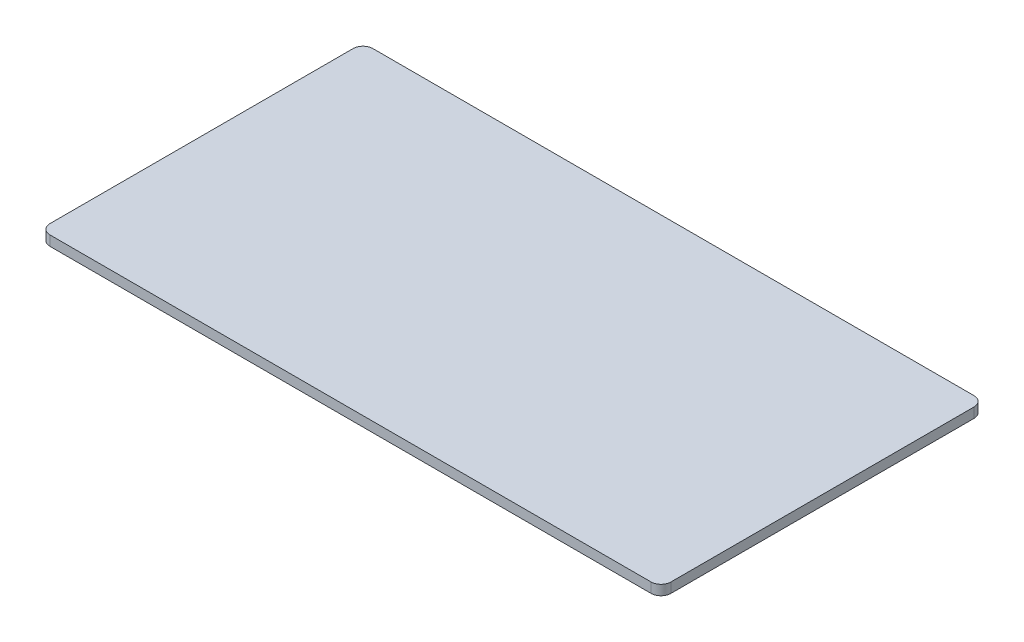
ISO-10303-21;
HEADER;
FILE_DESCRIPTION(('STEP AP214'),'2;1');
FILE_NAME('part.step','',(''),(''),'','','');
FILE_SCHEMA(('AUTOMOTIVE_DESIGN { 1 0 10303 214 1 1 1 1 }'));
ENDSEC;
DATA;
#1=APPLICATION_CONTEXT('core data for automotive mechanical design processes');
#2=APPLICATION_PROTOCOL_DEFINITION('international standard','automotive_design',2000,#1);
#3=PRODUCT_CONTEXT('',#1,'mechanical');
#4=PRODUCT('Part','Part','',(#3));
#5=PRODUCT_RELATED_PRODUCT_CATEGORY('part','',(#4));
#6=PRODUCT_DEFINITION_FORMATION('','',#4);
#7=PRODUCT_DEFINITION_CONTEXT('part definition',#1,'design');
#8=PRODUCT_DEFINITION('design','',#6,#7);
#9=PRODUCT_DEFINITION_SHAPE('','',#8);
#10=(LENGTH_UNIT() NAMED_UNIT(*) SI_UNIT(.MILLI.,.METRE.));
#11=(NAMED_UNIT(*) PLANE_ANGLE_UNIT() SI_UNIT($,.RADIAN.));
#12=(NAMED_UNIT(*) SI_UNIT($,.STERADIAN.) SOLID_ANGLE_UNIT());
#13=UNCERTAINTY_MEASURE_WITH_UNIT(LENGTH_MEASURE(1.E-05),#10,'distance_accuracy_value','');
#14=(GEOMETRIC_REPRESENTATION_CONTEXT(3) GLOBAL_UNCERTAINTY_ASSIGNED_CONTEXT((#13)) GLOBAL_UNIT_ASSIGNED_CONTEXT((#10,
#11,#12)) REPRESENTATION_CONTEXT('',''));
#15=CARTESIAN_POINT('',(0.,0.,0.));
#16=DIRECTION('',(0.,0.,1.));
#17=DIRECTION('',(1.,0.,0.));
#18=AXIS2_PLACEMENT_3D('',#15,#16,#17);
#19=CARTESIAN_POINT('',(1.38777878078145E-13,2.54,2.91433543964104E-13));
#20=DIRECTION('',(0.,0.,-1.));
#21=DIRECTION('',(-1.,0.,0.));
#22=AXIS2_PLACEMENT_3D('',#19,#20,#21);
#23=PLANE('',#22);
#24=DIRECTION('',(1.,0.,0.));
#25=VECTOR('',#24,1.);
#26=CARTESIAN_POINT('',(1.38777878078145E-13,2.54,2.91433543964104E-13));
#27=LINE('',#26,#25);
#28=CARTESIAN_POINT('',(2.54000000000014,2.54,2.91433543964104E-13));
#29=VERTEX_POINT('',#28);
#30=CARTESIAN_POINT('',(156.21,2.54,2.91433543964104E-13));
#31=VERTEX_POINT('',#30);
#32=EDGE_CURVE('E133',#29,#31,#27,.T.);
#33=ORIENTED_EDGE('',*,*,#32,.F.);
#34=DIRECTION('',(0.,-1.,0.));
#35=VECTOR('',#34,1.);
#36=CARTESIAN_POINT('',(2.54000000000014,2.54,2.91433543964104E-13));
#37=LINE('',#36,#35);
#38=CARTESIAN_POINT('',(2.54000000000014,0.,2.91433543964104E-13));
#39=VERTEX_POINT('',#38);
#40=EDGE_CURVE('E117',#29,#39,#37,.T.);
#41=ORIENTED_EDGE('',*,*,#40,.T.);
#42=DIRECTION('',(1.,0.,0.));
#43=VECTOR('',#42,1.);
#44=CARTESIAN_POINT('',(1.38777878078145E-13,0.,2.91433543964104E-13));
#45=LINE('',#44,#43);
#46=CARTESIAN_POINT('',(156.21,0.,2.91433543964104E-13));
#47=VERTEX_POINT('',#46);
#48=EDGE_CURVE('E130',#39,#47,#45,.T.);
#49=ORIENTED_EDGE('',*,*,#48,.T.);
#50=DIRECTION('',(0.,-1.,0.));
#51=VECTOR('',#50,1.);
#52=CARTESIAN_POINT('',(156.21,2.54,2.91433543964104E-13));
#53=LINE('',#52,#51);
#54=EDGE_CURVE('E136',#47,#31,#53,.F.);
#55=ORIENTED_EDGE('',*,*,#54,.T.);
#56=EDGE_LOOP('',(#33,#41,#49,#55));
#57=FACE_BOUND('',#56,.T.);
#58=ADVANCED_FACE('F46',(#57),#23,.F.);
#59=CARTESIAN_POINT('',(158.75,2.54,2.91433543964104E-13));
#60=DIRECTION('',(-1.,0.,0.));
#61=DIRECTION('',(0.,0.,1.));
#62=AXIS2_PLACEMENT_3D('',#59,#60,#61);
#63=PLANE('',#62);
#64=DIRECTION('',(0.,0.,-1.));
#65=VECTOR('',#64,1.);
#66=CARTESIAN_POINT('',(158.75,2.54,2.91433543964104E-13));
#67=LINE('',#66,#65);
#68=CARTESIAN_POINT('',(158.75,2.54,-2.53999999999971));
#69=VERTEX_POINT('',#68);
#70=CARTESIAN_POINT('',(158.75,2.54,-80.0099999999997));
#71=VERTEX_POINT('',#70);
#72=EDGE_CURVE('E187',#69,#71,#67,.T.);
#73=ORIENTED_EDGE('',*,*,#72,.F.);
#74=DIRECTION('',(0.,-1.,0.));
#75=VECTOR('',#74,1.);
#76=CARTESIAN_POINT('',(158.75,2.54,-2.53999999999971));
#77=LINE('',#76,#75);
#78=CARTESIAN_POINT('',(158.75,0.,-2.53999999999971));
#79=VERTEX_POINT('',#78);
#80=EDGE_CURVE('E203',#69,#79,#77,.T.);
#81=ORIENTED_EDGE('',*,*,#80,.T.);
#82=DIRECTION('',(0.,0.,-1.));
#83=VECTOR('',#82,1.);
#84=CARTESIAN_POINT('',(158.75,0.,2.91433543964104E-13));
#85=LINE('',#84,#83);
#86=CARTESIAN_POINT('',(158.75,0.,-80.0099999999997));
#87=VERTEX_POINT('',#86);
#88=EDGE_CURVE('E141',#79,#87,#85,.T.);
#89=ORIENTED_EDGE('',*,*,#88,.T.);
#90=DIRECTION('',(0.,-1.,0.));
#91=VECTOR('',#90,1.);
#92=CARTESIAN_POINT('',(158.75,2.54,-80.0099999999997));
#93=LINE('',#92,#91);
#94=EDGE_CURVE('E200',#87,#71,#93,.F.);
#95=ORIENTED_EDGE('',*,*,#94,.T.);
#96=EDGE_LOOP('',(#73,#81,#89,#95));
#97=FACE_BOUND('',#96,.T.);
#98=ADVANCED_FACE('F225',(#97),#63,.F.);
#99=CARTESIAN_POINT('',(1.38777878078145E-13,2.54,-82.5499999999997));
#100=DIRECTION('',(0.,0.,1.));
#101=DIRECTION('',(1.,0.,0.));
#102=AXIS2_PLACEMENT_3D('',#99,#100,#101);
#103=PLANE('',#102);
#104=DIRECTION('',(-1.,0.,0.));
#105=VECTOR('',#104,1.);
#106=CARTESIAN_POINT('',(1.38777878078145E-13,2.54,-82.5499999999997));
#107=LINE('',#106,#105);
#108=CARTESIAN_POINT('',(156.21,2.54,-82.5499999999997));
#109=VERTEX_POINT('',#108);
#110=CARTESIAN_POINT('',(2.54000000000014,2.54,-82.5499999999997));
#111=VERTEX_POINT('',#110);
#112=EDGE_CURVE('E184',#109,#111,#107,.T.);
#113=ORIENTED_EDGE('',*,*,#112,.F.);
#114=DIRECTION('',(0.,-1.,0.));
#115=VECTOR('',#114,1.);
#116=CARTESIAN_POINT('',(156.21,2.54,-82.5499999999997));
#117=LINE('',#116,#115);
#118=CARTESIAN_POINT('',(156.21,0.,-82.5499999999997));
#119=VERTEX_POINT('',#118);
#120=EDGE_CURVE('E12',#109,#119,#117,.T.);
#121=ORIENTED_EDGE('',*,*,#120,.T.);
#122=DIRECTION('',(-1.,0.,0.));
#123=VECTOR('',#122,1.);
#124=CARTESIAN_POINT('',(1.38777878078145E-13,0.,-82.5499999999997));
#125=LINE('',#124,#123);
#126=CARTESIAN_POINT('',(2.54000000000014,0.,-82.5499999999997));
#127=VERTEX_POINT('',#126);
#128=EDGE_CURVE('E145',#119,#127,#125,.T.);
#129=ORIENTED_EDGE('',*,*,#128,.T.);
#130=DIRECTION('',(0.,-1.,0.));
#131=VECTOR('',#130,1.);
#132=CARTESIAN_POINT('',(2.54000000000014,2.54,-82.5499999999997));
#133=LINE('',#132,#131);
#134=EDGE_CURVE('E55',#127,#111,#133,.F.);
#135=ORIENTED_EDGE('',*,*,#134,.T.);
#136=EDGE_LOOP('',(#113,#121,#129,#135));
#137=FACE_BOUND('',#136,.T.);
#138=ADVANCED_FACE('F218',(#137),#103,.F.);
#139=CARTESIAN_POINT('',(1.38777878078145E-13,2.54,2.91433543964104E-13));
#140=DIRECTION('',(1.,0.,0.));
#141=DIRECTION('',(0.,0.,-1.));
#142=AXIS2_PLACEMENT_3D('',#139,#140,#141);
#143=PLANE('',#142);
#144=DIRECTION('',(0.,0.,1.));
#145=VECTOR('',#144,1.);
#146=CARTESIAN_POINT('',(1.38777878078145E-13,0.,2.91433543964104E-13));
#147=LINE('',#146,#145);
#148=CARTESIAN_POINT('',(1.38777878078145E-13,0.,-80.0099999999997));
#149=VERTEX_POINT('',#148);
#150=CARTESIAN_POINT('',(1.38777878078145E-13,0.,-2.53999999999971));
#151=VERTEX_POINT('',#150);
#152=EDGE_CURVE('E154',#149,#151,#147,.T.);
#153=ORIENTED_EDGE('',*,*,#152,.T.);
#154=DIRECTION('',(0.,-1.,0.));
#155=VECTOR('',#154,1.);
#156=CARTESIAN_POINT('',(1.38777878078145E-13,2.54,-2.53999999999971));
#157=LINE('',#156,#155);
#158=CARTESIAN_POINT('',(1.38777878078145E-13,2.54,-2.53999999999971));
#159=VERTEX_POINT('',#158);
#160=EDGE_CURVE('E118',#151,#159,#157,.F.);
#161=ORIENTED_EDGE('',*,*,#160,.T.);
#162=DIRECTION('',(0.,0.,1.));
#163=VECTOR('',#162,1.);
#164=CARTESIAN_POINT('',(1.38777878078145E-13,2.54,2.91433543964104E-13));
#165=LINE('',#164,#163);
#166=CARTESIAN_POINT('',(1.38777878078145E-13,2.54,-80.0099999999997));
#167=VERTEX_POINT('',#166);
#168=EDGE_CURVE('E148',#167,#159,#165,.T.);
#169=ORIENTED_EDGE('',*,*,#168,.F.);
#170=DIRECTION('',(0.,-1.,0.));
#171=VECTOR('',#170,1.);
#172=CARTESIAN_POINT('',(1.38777878078145E-13,2.54,-80.0099999999997));
#173=LINE('',#172,#171);
#174=EDGE_CURVE('E124',#167,#149,#173,.T.);
#175=ORIENTED_EDGE('',*,*,#174,.T.);
#176=EDGE_LOOP('',(#153,#161,#169,#175));
#177=FACE_BOUND('',#176,.T.);
#178=ADVANCED_FACE('F215',(#177),#143,.F.);
#179=CARTESIAN_POINT('',(0.,2.54,0.));
#180=DIRECTION('',(0.,1.,0.));
#181=DIRECTION('',(0.,0.,1.));
#182=AXIS2_PLACEMENT_3D('',#179,#180,#181);
#183=PLANE('',#182);
#184=ORIENTED_EDGE('',*,*,#168,.T.);
#185=CARTESIAN_POINT('',(2.54000000000014,2.54,-2.53999999999971));
#186=DIRECTION('',(0.,1.,0.));
#187=DIRECTION('',(0.,0.,1.));
#188=AXIS2_PLACEMENT_3D('',#185,#186,#187);
#189=CIRCLE('',#188,2.54);
#190=EDGE_CURVE('E196',#159,#29,#189,.T.);
#191=ORIENTED_EDGE('',*,*,#190,.T.);
#192=ORIENTED_EDGE('',*,*,#32,.T.);
#193=CARTESIAN_POINT('',(156.21,2.54,-2.53999999999971));
#194=DIRECTION('',(0.,1.,0.));
#195=DIRECTION('',(0.,0.,1.));
#196=AXIS2_PLACEMENT_3D('',#193,#194,#195);
#197=CIRCLE('',#196,2.54);
#198=EDGE_CURVE('E177',#31,#69,#197,.T.);
#199=ORIENTED_EDGE('',*,*,#198,.T.);
#200=ORIENTED_EDGE('',*,*,#72,.T.);
#201=CARTESIAN_POINT('',(156.21,2.54,-80.0099999999997));
#202=DIRECTION('',(0.,1.,0.));
#203=DIRECTION('',(0.,0.,1.));
#204=AXIS2_PLACEMENT_3D('',#201,#202,#203);
#205=CIRCLE('',#204,2.54);
#206=EDGE_CURVE('E68',#71,#109,#205,.T.);
#207=ORIENTED_EDGE('',*,*,#206,.T.);
#208=ORIENTED_EDGE('',*,*,#112,.T.);
#209=CARTESIAN_POINT('',(2.54000000000014,2.54,-80.0099999999997));
#210=DIRECTION('',(0.,1.,0.));
#211=DIRECTION('',(0.,0.,1.));
#212=AXIS2_PLACEMENT_3D('',#209,#210,#211);
#213=CIRCLE('',#212,2.54);
#214=EDGE_CURVE('E170',#111,#167,#213,.T.);
#215=ORIENTED_EDGE('',*,*,#214,.T.);
#216=EDGE_LOOP('',(#184,#191,#192,#199,#200,#207,#208,#215));
#217=FACE_BOUND('',#216,.T.);
#218=ADVANCED_FACE('F211',(#217),#183,.T.);
#219=CARTESIAN_POINT('',(0.,0.,0.));
#220=DIRECTION('',(0.,1.,0.));
#221=DIRECTION('',(0.,0.,1.));
#222=AXIS2_PLACEMENT_3D('',#219,#220,#221);
#223=PLANE('',#222);
#224=ORIENTED_EDGE('',*,*,#48,.F.);
#225=CARTESIAN_POINT('',(2.54000000000014,0.,-2.53999999999971));
#226=DIRECTION('',(0.,1.,0.));
#227=DIRECTION('',(0.,0.,1.));
#228=AXIS2_PLACEMENT_3D('',#225,#226,#227);
#229=CIRCLE('',#228,2.54);
#230=EDGE_CURVE('E113',#39,#151,#229,.F.);
#231=ORIENTED_EDGE('',*,*,#230,.T.);
#232=ORIENTED_EDGE('',*,*,#152,.F.);
#233=CARTESIAN_POINT('',(2.54000000000014,0.,-80.0099999999997));
#234=DIRECTION('',(0.,1.,0.));
#235=DIRECTION('',(0.,0.,1.));
#236=AXIS2_PLACEMENT_3D('',#233,#234,#235);
#237=CIRCLE('',#236,2.54);
#238=EDGE_CURVE('E135',#149,#127,#237,.F.);
#239=ORIENTED_EDGE('',*,*,#238,.T.);
#240=ORIENTED_EDGE('',*,*,#128,.F.);
#241=CARTESIAN_POINT('',(156.21,0.,-80.0099999999997));
#242=DIRECTION('',(0.,1.,0.));
#243=DIRECTION('',(0.,0.,1.));
#244=AXIS2_PLACEMENT_3D('',#241,#242,#243);
#245=CIRCLE('',#244,2.54);
#246=EDGE_CURVE('E161',#119,#87,#245,.F.);
#247=ORIENTED_EDGE('',*,*,#246,.T.);
#248=ORIENTED_EDGE('',*,*,#88,.F.);
#249=CARTESIAN_POINT('',(156.21,0.,-2.53999999999971));
#250=DIRECTION('',(0.,1.,0.));
#251=DIRECTION('',(0.,0.,1.));
#252=AXIS2_PLACEMENT_3D('',#249,#250,#251);
#253=CIRCLE('',#252,2.54);
#254=EDGE_CURVE('E125',#79,#47,#253,.F.);
#255=ORIENTED_EDGE('',*,*,#254,.T.);
#256=EDGE_LOOP('',(#224,#231,#232,#239,#240,#247,#248,#255));
#257=FACE_BOUND('',#256,.T.);
#258=ADVANCED_FACE('F138',(#257),#223,.F.);
#259=CARTESIAN_POINT('',(2.54000000000014,2.54,-2.53999999999971));
#260=DIRECTION('',(0.,-1.,0.));
#261=DIRECTION('',(0.,0.,-1.));
#262=AXIS2_PLACEMENT_3D('',#259,#260,#261);
#263=CYLINDRICAL_SURFACE('',#262,2.54);
#264=ORIENTED_EDGE('',*,*,#190,.F.);
#265=ORIENTED_EDGE('',*,*,#160,.F.);
#266=ORIENTED_EDGE('',*,*,#230,.F.);
#267=ORIENTED_EDGE('',*,*,#40,.F.);
#268=EDGE_LOOP('',(#264,#265,#266,#267));
#269=FACE_BOUND('',#268,.T.);
#270=ADVANCED_FACE('F116',(#269),#263,.T.);
#271=CARTESIAN_POINT('',(156.21,2.54,-2.53999999999971));
#272=DIRECTION('',(0.,-1.,0.));
#273=DIRECTION('',(0.,0.,-1.));
#274=AXIS2_PLACEMENT_3D('',#271,#272,#273);
#275=CYLINDRICAL_SURFACE('',#274,2.54);
#276=ORIENTED_EDGE('',*,*,#198,.F.);
#277=ORIENTED_EDGE('',*,*,#54,.F.);
#278=ORIENTED_EDGE('',*,*,#254,.F.);
#279=ORIENTED_EDGE('',*,*,#80,.F.);
#280=EDGE_LOOP('',(#276,#277,#278,#279));
#281=FACE_BOUND('',#280,.T.);
#282=ADVANCED_FACE('F229',(#281),#275,.T.);
#283=CARTESIAN_POINT('',(156.21,2.54,-80.0099999999997));
#284=DIRECTION('',(0.,-1.,0.));
#285=DIRECTION('',(0.,0.,-1.));
#286=AXIS2_PLACEMENT_3D('',#283,#284,#285);
#287=CYLINDRICAL_SURFACE('',#286,2.54);
#288=ORIENTED_EDGE('',*,*,#206,.F.);
#289=ORIENTED_EDGE('',*,*,#94,.F.);
#290=ORIENTED_EDGE('',*,*,#246,.F.);
#291=ORIENTED_EDGE('',*,*,#120,.F.);
#292=EDGE_LOOP('',(#288,#289,#290,#291));
#293=FACE_BOUND('',#292,.T.);
#294=ADVANCED_FACE('F221',(#293),#287,.T.);
#295=CARTESIAN_POINT('',(2.54000000000014,2.54,-80.0099999999997));
#296=DIRECTION('',(0.,-1.,0.));
#297=DIRECTION('',(0.,0.,-1.));
#298=AXIS2_PLACEMENT_3D('',#295,#296,#297);
#299=CYLINDRICAL_SURFACE('',#298,2.54);
#300=ORIENTED_EDGE('',*,*,#214,.F.);
#301=ORIENTED_EDGE('',*,*,#134,.F.);
#302=ORIENTED_EDGE('',*,*,#238,.F.);
#303=ORIENTED_EDGE('',*,*,#174,.F.);
#304=EDGE_LOOP('',(#300,#301,#302,#303));
#305=FACE_BOUND('',#304,.T.);
#306=ADVANCED_FACE('F48',(#305),#299,.T.);
#307=CLOSED_SHELL('',(#58,#98,#138,#178,#218,#258,#270,#282,#294,#306));
#308=MANIFOLD_SOLID_BREP('B2',#307);
#309=ADVANCED_BREP_SHAPE_REPRESENTATION('',(#18,#308),#14);
#310=SHAPE_DEFINITION_REPRESENTATION(#9,#309);
ENDSEC;
END-ISO-10303-21;
